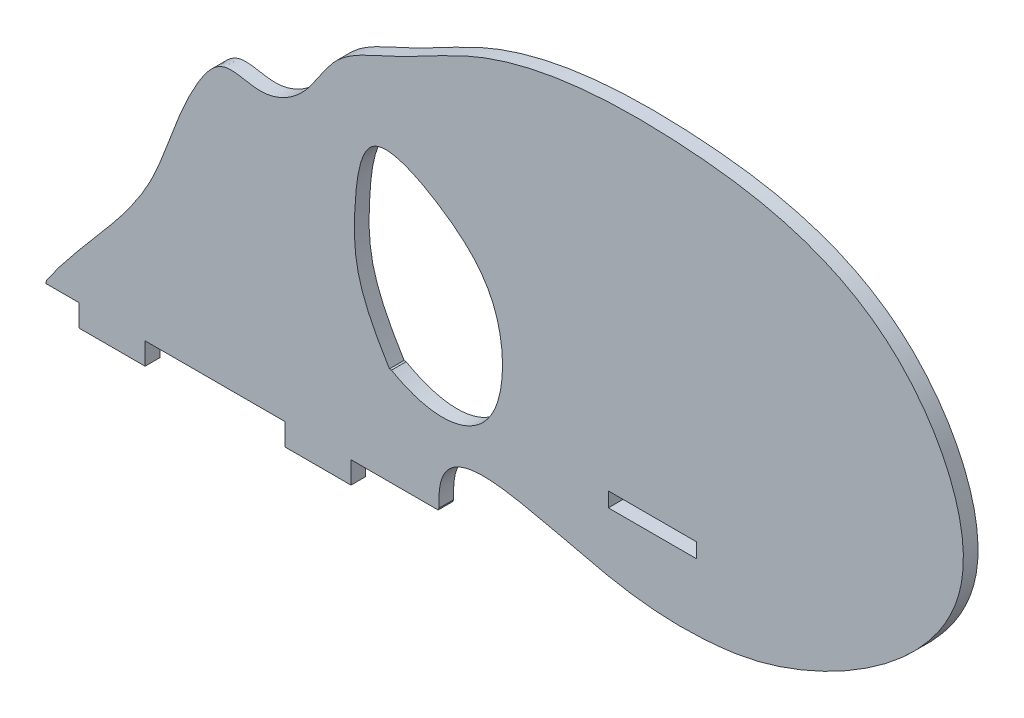
ISO-10303-21;
HEADER;
FILE_DESCRIPTION(('STEP AP214'),'2;1');
FILE_NAME('part.step','',(''),(''),'','','');
FILE_SCHEMA(('AUTOMOTIVE_DESIGN { 1 0 10303 214 1 1 1 1 }'));
ENDSEC;
DATA;
#1=APPLICATION_CONTEXT('core data for automotive mechanical design processes');
#2=APPLICATION_PROTOCOL_DEFINITION('international standard','automotive_design',2000,#1);
#3=PRODUCT_CONTEXT('',#1,'mechanical');
#4=PRODUCT('Part','Part','',(#3));
#5=PRODUCT_RELATED_PRODUCT_CATEGORY('part','',(#4));
#6=PRODUCT_DEFINITION_FORMATION('','',#4);
#7=PRODUCT_DEFINITION_CONTEXT('part definition',#1,'design');
#8=PRODUCT_DEFINITION('design','',#6,#7);
#9=PRODUCT_DEFINITION_SHAPE('','',#8);
#10=(LENGTH_UNIT() NAMED_UNIT(*) SI_UNIT(.MILLI.,.METRE.));
#11=(NAMED_UNIT(*) PLANE_ANGLE_UNIT() SI_UNIT($,.RADIAN.));
#12=(NAMED_UNIT(*) SI_UNIT($,.STERADIAN.) SOLID_ANGLE_UNIT());
#13=UNCERTAINTY_MEASURE_WITH_UNIT(LENGTH_MEASURE(1.E-05),#10,'distance_accuracy_value','');
#14=(GEOMETRIC_REPRESENTATION_CONTEXT(3) GLOBAL_UNCERTAINTY_ASSIGNED_CONTEXT((#13)) GLOBAL_UNIT_ASSIGNED_CONTEXT((#10,
#11,#12)) REPRESENTATION_CONTEXT('',''));
#15=CARTESIAN_POINT('',(0.,0.,0.));
#16=DIRECTION('',(0.,0.,1.));
#17=DIRECTION('',(1.,0.,0.));
#18=AXIS2_PLACEMENT_3D('',#15,#16,#17);
#19=CARTESIAN_POINT('',(46.7139427008838,14.6192871109886,0.529181018168488));
#20=DIRECTION('',(0.,0.,1.));
#21=DIRECTION('',(1.,0.,0.));
#22=AXIS2_PLACEMENT_3D('',#19,#20,#21);
#23=PLANE('',#22);
#24=DIRECTION('',(0.,-1.,0.));
#25=VECTOR('',#24,1.);
#26=CARTESIAN_POINT('',(97.4290343826983,14.6192871109886,0.529181018168488));
#27=LINE('',#26,#25);
#28=CARTESIAN_POINT('',(97.4290343826983,14.6192871109886,0.529181018168488));
#29=VERTEX_POINT('',#28);
#30=CARTESIAN_POINT('',(97.4290343826983,9.85678711098861,0.529181018168488));
#31=VERTEX_POINT('',#30);
#32=EDGE_CURVE('E304',#29,#31,#27,.T.);
#33=ORIENTED_EDGE('',*,*,#32,.T.);
#34=DIRECTION('',(1.,0.,0.));
#35=VECTOR('',#34,1.);
#36=CARTESIAN_POINT('',(46.7139427008838,9.85678711098862,0.529181018168488));
#37=LINE('',#36,#35);
#38=CARTESIAN_POINT('',(83.1415343826983,9.85678711098862,0.529181018168488));
#39=VERTEX_POINT('',#38);
#40=EDGE_CURVE('E645',#39,#31,#37,.T.);
#41=ORIENTED_EDGE('',*,*,#40,.F.);
#42=DIRECTION('',(0.,-1.,0.));
#43=VECTOR('',#42,1.);
#44=CARTESIAN_POINT('',(83.1415343826983,14.6192871109886,0.529181018168488));
#45=LINE('',#44,#43);
#46=CARTESIAN_POINT('',(83.1415343826983,14.6192871109886,0.529181018168488));
#47=VERTEX_POINT('',#46);
#48=EDGE_CURVE('E641',#47,#39,#45,.T.);
#49=ORIENTED_EDGE('',*,*,#48,.F.);
#50=DIRECTION('',(1.,0.,0.));
#51=VECTOR('',#50,1.);
#52=CARTESIAN_POINT('',(75.9977843826983,14.6192871109886,0.529181018168488));
#53=LINE('',#52,#51);
#54=CARTESIAN_POINT('',(75.9977843826983,14.6192871109886,0.529181018168488));
#55=VERTEX_POINT('',#54);
#56=EDGE_CURVE('E360',#55,#47,#53,.T.);
#57=ORIENTED_EDGE('',*,*,#56,.F.);
#58=DIRECTION('',(-0.131362101592818,-0.991334453282603,0.));
#59=VECTOR('',#58,1.);
#60=CARTESIAN_POINT('',(76.0795877483781,15.2366226576158,0.529181018168488));
#61=LINE('',#60,#59);
#62=CARTESIAN_POINT('',(76.0795877483781,15.2366226576158,0.529181018168488));
#63=VERTEX_POINT('',#62);
#64=EDGE_CURVE('E364',#63,#55,#61,.T.);
#65=ORIENTED_EDGE('',*,*,#64,.F.);
#66=CARTESIAN_POINT('',(76.0795877483781,15.2366226576158,0.529181018168488));
#67=CARTESIAN_POINT('',(78.5136995982395,18.9196984781947,0.529181018168488));
#68=CARTESIAN_POINT('',(86.384545653576,28.483276786645,0.529181018168488));
#69=CARTESIAN_POINT('',(100.791998823082,44.6915469108842,0.529181018168488));
#70=CARTESIAN_POINT('',(104.435020119309,62.9076807843859,0.529181018168488));
#71=CARTESIAN_POINT('',(113.904961423502,76.2523157443996,0.529181018168488));
#72=CARTESIAN_POINT('',(123.275231297971,72.424496811775,0.529181018168488));
#73=CARTESIAN_POINT('',(132.927126722077,77.913549351878,0.529181018168488));
#74=CARTESIAN_POINT('',(137.9633658612,89.4214305439055,0.529181018168488));
#75=CARTESIAN_POINT('',(152.686437338271,94.8702639667779,0.529181018168488));
#76=CARTESIAN_POINT('',(175.095319894484,108.643375828435,0.529181018168488));
#77=CARTESIAN_POINT('',(214.4991228579,111.528800242128,0.529181018168488));
#78=CARTESIAN_POINT('',(260.687847393146,101.991149201834,0.529181018168488));
#79=CARTESIAN_POINT('',(280.794988715995,60.2074091425071,0.529181018168488));
#80=CARTESIAN_POINT('',(260.092155651938,32.8972212167917,0.529181018168488));
#81=CARTESIAN_POINT('',(239.430987817911,23.2489467627401,0.529181018168488));
#82=CARTESIAN_POINT('',(230.113208091843,20.8819530988946,0.529181018168488));
#83=B_SPLINE_CURVE_WITH_KNOTS('',3,(#66,#67,#68,#69,#70,#71,#72,#73,#74,#75,#76,#77,#78,#79,#80,
#81,#82),.UNSPECIFIED.,.F.,.F.,(4,1,1,1,1,1,1,1,1,1,1,1,1,1,4),(0.00226241646687188,
0.042851836601177,0.112266622936458,0.191197814197318,0.215776327855184,0.238595903349676,
0.269392038066296,0.305262453845229,0.346354398059261,0.40290844863562,0.54272456628568,
0.688695661350589,0.802663517836792,0.881805413191487,0.976115532404342),.UNSPECIFIED.);
#84=CARTESIAN_POINT('',(230.113208091843,20.8819530988946,0.529181018168488));
#85=VERTEX_POINT('',#84);
#86=EDGE_CURVE('E326',#63,#85,#83,.T.);
#87=ORIENTED_EDGE('',*,*,#86,.T.);
#88=DIRECTION('',(-0.9804127584769,-0.196953860118849,0.));
#89=VECTOR('',#88,1.);
#90=CARTESIAN_POINT('',(230.113208091843,20.8819530988946,0.529181018168488));
#91=LINE('',#90,#89);
#92=CARTESIAN_POINT('',(225.059321782838,19.8666843678892,0.529181018168488));
#93=VERTEX_POINT('',#92);
#94=EDGE_CURVE('E332',#85,#93,#91,.T.);
#95=ORIENTED_EDGE('',*,*,#94,.T.);
#96=CARTESIAN_POINT('',(160.990463266534,15.0540625014356,0.529181018168488));
#97=CARTESIAN_POINT('',(160.961317729062,15.7990132081779,0.529181018168488));
#98=CARTESIAN_POINT('',(160.750347397598,27.8817390805604,0.529181018168488));
#99=CARTESIAN_POINT('',(180.241454751576,25.1480193040991,0.529181018168488));
#100=CARTESIAN_POINT('',(203.516820255264,18.5816502297192,0.529181018168488));
#101=CARTESIAN_POINT('',(217.022935127163,18.7029481051344,0.529181018168488));
#102=CARTESIAN_POINT('',(225.059321782838,19.8666843678892,0.529181018168488));
#103=B_SPLINE_CURVE_WITH_KNOTS('',3,(#96,#97,#98,#99,#100,#101,#102),.UNSPECIFIED.,.F.,.F.,(4,1,
1,1,4),(0.00653865057941829,0.0242648396256075,0.142987538878755,0.246415567474758,
0.403693801674327),.UNSPECIFIED.);
#104=CARTESIAN_POINT('',(160.990463266534,15.0540625014356,0.529181018168488));
#105=VERTEX_POINT('',#104);
#106=EDGE_CURVE('E338',#105,#93,#103,.T.);
#107=ORIENTED_EDGE('',*,*,#106,.F.);
#108=DIRECTION('',(-0.373907961816468,-0.927465813973892,0.));
#109=VECTOR('',#108,1.);
#110=CARTESIAN_POINT('',(160.990463266534,15.0540625014356,0.529181018168488));
#111=LINE('',#110,#109);
#112=CARTESIAN_POINT('',(160.815183512132,14.6192871109886,0.529181018168488));
#113=VERTEX_POINT('',#112);
#114=EDGE_CURVE('E343',#105,#113,#111,.T.);
#115=ORIENTED_EDGE('',*,*,#114,.T.);
#116=DIRECTION('',(1.,0.,0.));
#117=VECTOR('',#116,1.);
#118=CARTESIAN_POINT('',(141.963942700884,14.6192871109886,0.529181018168488));
#119=LINE('',#118,#117);
#120=CARTESIAN_POINT('',(141.963942700884,14.6192871109886,0.529181018168488));
#121=VERTEX_POINT('',#120);
#122=EDGE_CURVE('E349',#121,#113,#119,.T.);
#123=ORIENTED_EDGE('',*,*,#122,.F.);
#124=DIRECTION('',(0.,-1.,0.));
#125=VECTOR('',#124,1.);
#126=CARTESIAN_POINT('',(141.963942700884,14.6192871109886,0.529181018168488));
#127=LINE('',#126,#125);
#128=CARTESIAN_POINT('',(141.963942700884,9.85678711098862,0.529181018168488));
#129=VERTEX_POINT('',#128);
#130=EDGE_CURVE('E352',#121,#129,#127,.T.);
#131=ORIENTED_EDGE('',*,*,#130,.T.);
#132=DIRECTION('',(1.,0.,0.));
#133=VECTOR('',#132,1.);
#134=CARTESIAN_POINT('',(127.676442700884,9.85678711098862,0.529181018168488));
#135=LINE('',#134,#133);
#136=CARTESIAN_POINT('',(127.676442700884,9.85678711098862,0.529181018168488));
#137=VERTEX_POINT('',#136);
#138=EDGE_CURVE('E355',#137,#129,#135,.T.);
#139=ORIENTED_EDGE('',*,*,#138,.F.);
#140=DIRECTION('',(0.,-1.,0.));
#141=VECTOR('',#140,1.);
#142=CARTESIAN_POINT('',(127.676442700884,14.6192871109886,0.529181018168488));
#143=LINE('',#142,#141);
#144=CARTESIAN_POINT('',(127.676442700884,14.6192871109886,0.529181018168488));
#145=VERTEX_POINT('',#144);
#146=EDGE_CURVE('E358',#145,#137,#143,.T.);
#147=ORIENTED_EDGE('',*,*,#146,.F.);
#148=EDGE_CURVE('E363',#29,#145,#53,.T.);
#149=ORIENTED_EDGE('',*,*,#148,.F.);
#150=EDGE_LOOP('',(#33,#41,#49,#57,#65,#87,#95,#107,#115,#123,#131,#139,#147,#149));
#151=FACE_BOUND('',#150,.T.);
#152=CARTESIAN_POINT('',(150.707814048732,35.7612794961737,0.529181018168488));
#153=CARTESIAN_POINT('',(150.383039261352,35.7352008846273,0.529181018168488));
#154=CARTESIAN_POINT('',(150.271989668101,35.7901518709999,0.529181018168488));
#155=B_SPLINE_CURVE_WITH_KNOTS('',2,(#152,#153,#154),.UNSPECIFIED.,.F.,.F.,(3,3),(0.,
0.0587400437451956),.UNSPECIFIED.);
#156=CARTESIAN_POINT('',(150.707814048732,35.7612794961737,0.529181018168488));
#157=VERTEX_POINT('',#156);
#158=CARTESIAN_POINT('',(150.271989668101,35.7901518709999,0.529181018168488));
#159=VERTEX_POINT('',#158);
#160=EDGE_CURVE('E428',#157,#159,#155,.T.);
#161=ORIENTED_EDGE('',*,*,#160,.F.);
#162=CARTESIAN_POINT('',(150.271989668101,35.7901518709999,0.529181018168488));
#163=CARTESIAN_POINT('',(147.272484096382,40.6583748058132,0.529181018168488));
#164=CARTESIAN_POINT('',(142.65739432738,49.1509405033225,0.529181018168488));
#165=CARTESIAN_POINT('',(142.509838720055,62.7192927520831,0.529181018168488));
#166=CARTESIAN_POINT('',(144.707936444547,80.4577396705887,0.529181018168488));
#167=CARTESIAN_POINT('',(163.548850960502,71.2967227420742,0.529181018168488));
#168=CARTESIAN_POINT('',(175.307877403917,59.6011667715246,0.529181018168488));
#169=CARTESIAN_POINT('',(175.242309153813,32.8659839064675,0.529181018168488));
#170=CARTESIAN_POINT('',(160.498560619477,30.190843255926,0.529181018168488));
#171=CARTESIAN_POINT('',(150.707814048732,35.7612794961737,0.529181018168488));
#172=B_SPLINE_CURVE_WITH_KNOTS('',3,(#162,#163,#164,#165,#166,#167,#168,#169,#170,#171),
.UNSPECIFIED.,.F.,.F.,(4,1,1,1,1,1,1,4),(0.1636315853678,0.279802377306264,0.365863399168879,
0.45947757732539,0.562318617098575,0.686929258428295,0.810907839038093,1.),.UNSPECIFIED.);
#173=EDGE_CURVE('E434',#159,#157,#172,.T.);
#174=ORIENTED_EDGE('',*,*,#173,.F.);
#175=EDGE_LOOP('',(#161,#174));
#176=FACE_BOUND('',#175,.T.);
#177=DIRECTION('',(0.,1.,0.));
#178=VECTOR('',#177,1.);
#179=CARTESIAN_POINT('',(216.670767504084,33.4268021560606,0.52918101817114));
#180=LINE('',#179,#178);
#181=CARTESIAN_POINT('',(216.670767504084,33.4268021560606,0.52918101817114));
#182=VERTEX_POINT('',#181);
#183=CARTESIAN_POINT('',(216.670767504084,36.6018021560606,0.52918101817114));
#184=VERTEX_POINT('',#183);
#185=EDGE_CURVE('E667',#182,#184,#180,.T.);
#186=ORIENTED_EDGE('',*,*,#185,.T.);
#187=DIRECTION('',(1.,0.,0.));
#188=VECTOR('',#187,1.);
#189=CARTESIAN_POINT('',(46.7139427008838,36.6018021560606,0.529181018168488));
#190=LINE('',#189,#188);
#191=CARTESIAN_POINT('',(197.620767504084,36.6018021560606,0.529181018171382));
#192=VERTEX_POINT('',#191);
#193=EDGE_CURVE('E441',#192,#184,#190,.T.);
#194=ORIENTED_EDGE('',*,*,#193,.F.);
#195=DIRECTION('',(0.,1.,0.));
#196=VECTOR('',#195,1.);
#197=CARTESIAN_POINT('',(197.620767504084,33.4268021560606,0.529181018171382));
#198=LINE('',#197,#196);
#199=CARTESIAN_POINT('',(197.620767504084,33.4268021560606,0.529181018168488));
#200=VERTEX_POINT('',#199);
#201=EDGE_CURVE('E284',#200,#192,#198,.T.);
#202=ORIENTED_EDGE('',*,*,#201,.F.);
#203=DIRECTION('',(1.,0.,0.));
#204=VECTOR('',#203,1.);
#205=CARTESIAN_POINT('',(197.620767504084,33.4268021560606,0.529181018171382));
#206=LINE('',#205,#204);
#207=EDGE_CURVE('E285',#200,#182,#206,.T.);
#208=ORIENTED_EDGE('',*,*,#207,.T.);
#209=EDGE_LOOP('',(#186,#194,#202,#208));
#210=FACE_BOUND('',#209,.T.);
#211=ADVANCED_FACE('F145',(#151,#176,#210),#23,.F.);
#212=CARTESIAN_POINT('',(46.7139427008838,14.6192871109886,3.70418101816849));
#213=DIRECTION('',(0.,0.,1.));
#214=DIRECTION('',(1.,0.,0.));
#215=AXIS2_PLACEMENT_3D('',#212,#213,#214);
#216=PLANE('',#215);
#217=DIRECTION('',(0.,1.,0.));
#218=VECTOR('',#217,1.);
#219=CARTESIAN_POINT('',(197.620767504084,33.4268021560606,3.70418101817157));
#220=LINE('',#219,#218);
#221=CARTESIAN_POINT('',(197.620767504084,33.4268021560606,3.70418101817157));
#222=VERTEX_POINT('',#221);
#223=CARTESIAN_POINT('',(197.620767504084,36.6018021560606,3.70418101816849));
#224=VERTEX_POINT('',#223);
#225=EDGE_CURVE('E280',#222,#224,#220,.T.);
#226=ORIENTED_EDGE('',*,*,#225,.T.);
#227=DIRECTION('',(1.,0.,0.));
#228=VECTOR('',#227,1.);
#229=CARTESIAN_POINT('',(46.7139427008838,36.6018021560606,3.70418101816849));
#230=LINE('',#229,#228);
#231=CARTESIAN_POINT('',(216.670767504084,36.6018021560606,3.70418101817132));
#232=VERTEX_POINT('',#231);
#233=EDGE_CURVE('E12',#224,#232,#230,.T.);
#234=ORIENTED_EDGE('',*,*,#233,.T.);
#235=DIRECTION('',(0.,1.,0.));
#236=VECTOR('',#235,1.);
#237=CARTESIAN_POINT('',(216.670767504084,33.4268021560606,3.70418101817132));
#238=LINE('',#237,#236);
#239=CARTESIAN_POINT('',(216.670767504084,33.4268021560606,3.70418101817132));
#240=VERTEX_POINT('',#239);
#241=EDGE_CURVE('E296',#240,#232,#238,.T.);
#242=ORIENTED_EDGE('',*,*,#241,.F.);
#243=DIRECTION('',(1.,0.,0.));
#244=VECTOR('',#243,1.);
#245=CARTESIAN_POINT('',(46.7139427008838,33.4268021560606,3.70418101816849));
#246=LINE('',#245,#244);
#247=EDGE_CURVE('E153',#222,#240,#246,.T.);
#248=ORIENTED_EDGE('',*,*,#247,.F.);
#249=EDGE_LOOP('',(#226,#234,#242,#248));
#250=FACE_BOUND('',#249,.T.);
#251=DIRECTION('',(0.,-1.,0.));
#252=VECTOR('',#251,1.);
#253=CARTESIAN_POINT('',(97.4290343826983,14.6192871109886,3.70418101816849));
#254=LINE('',#253,#252);
#255=CARTESIAN_POINT('',(97.4290343826983,14.6192871109886,3.70418101816849));
#256=VERTEX_POINT('',#255);
#257=CARTESIAN_POINT('',(97.4290343826983,9.85678711098861,3.70418101816849));
#258=VERTEX_POINT('',#257);
#259=EDGE_CURVE('E649',#256,#258,#254,.T.);
#260=ORIENTED_EDGE('',*,*,#259,.F.);
#261=DIRECTION('',(1.,0.,0.));
#262=VECTOR('',#261,1.);
#263=CARTESIAN_POINT('',(75.9977843826983,14.6192871109886,3.70418101816849));
#264=LINE('',#263,#262);
#265=CARTESIAN_POINT('',(127.676442700884,14.6192871109886,3.70418101816849));
#266=VERTEX_POINT('',#265);
#267=EDGE_CURVE('E420',#256,#266,#264,.T.);
#268=ORIENTED_EDGE('',*,*,#267,.T.);
#269=DIRECTION('',(0.,-1.,0.));
#270=VECTOR('',#269,1.);
#271=CARTESIAN_POINT('',(127.676442700884,14.6192871109886,3.70418101816849));
#272=LINE('',#271,#270);
#273=CARTESIAN_POINT('',(127.676442700884,9.85678711098862,3.70418101816849));
#274=VERTEX_POINT('',#273);
#275=EDGE_CURVE('E415',#266,#274,#272,.T.);
#276=ORIENTED_EDGE('',*,*,#275,.T.);
#277=DIRECTION('',(1.,0.,0.));
#278=VECTOR('',#277,1.);
#279=CARTESIAN_POINT('',(127.676442700884,9.85678711098862,3.70418101816849));
#280=LINE('',#279,#278);
#281=CARTESIAN_POINT('',(141.963942700884,9.85678711098862,3.70418101816849));
#282=VERTEX_POINT('',#281);
#283=EDGE_CURVE('E413',#274,#282,#280,.T.);
#284=ORIENTED_EDGE('',*,*,#283,.T.);
#285=DIRECTION('',(0.,-1.,0.));
#286=VECTOR('',#285,1.);
#287=CARTESIAN_POINT('',(141.963942700884,14.6192871109886,3.70418101816849));
#288=LINE('',#287,#286);
#289=CARTESIAN_POINT('',(141.963942700884,14.6192871109886,3.70418101816849));
#290=VERTEX_POINT('',#289);
#291=EDGE_CURVE('E410',#290,#282,#288,.T.);
#292=ORIENTED_EDGE('',*,*,#291,.F.);
#293=DIRECTION('',(1.,0.,0.));
#294=VECTOR('',#293,1.);
#295=CARTESIAN_POINT('',(141.963942700884,14.6192871109886,3.70418101816849));
#296=LINE('',#295,#294);
#297=CARTESIAN_POINT('',(160.815183512132,14.6192871109886,3.70418101816849));
#298=VERTEX_POINT('',#297);
#299=EDGE_CURVE('E408',#290,#298,#296,.T.);
#300=ORIENTED_EDGE('',*,*,#299,.T.);
#301=DIRECTION('',(-0.373907961816468,-0.927465813973892,0.));
#302=VECTOR('',#301,1.);
#303=CARTESIAN_POINT('',(160.990463266534,15.0540625014356,3.70418101816849));
#304=LINE('',#303,#302);
#305=CARTESIAN_POINT('',(160.990463266534,15.0540625014356,3.70418101816849));
#306=VERTEX_POINT('',#305);
#307=EDGE_CURVE('E402',#306,#298,#304,.T.);
#308=ORIENTED_EDGE('',*,*,#307,.F.);
#309=CARTESIAN_POINT('',(160.990463266534,15.0540625014356,3.70418101816849));
#310=CARTESIAN_POINT('',(160.961317729062,15.7990132081779,3.70418101816849));
#311=CARTESIAN_POINT('',(160.750347397598,27.8817390805604,3.70418101816849));
#312=CARTESIAN_POINT('',(180.241454751576,25.1480193040991,3.70418101816849));
#313=CARTESIAN_POINT('',(203.516820255264,18.5816502297192,3.70418101816849));
#314=CARTESIAN_POINT('',(217.022935127163,18.7029481051344,3.70418101816849));
#315=CARTESIAN_POINT('',(225.059321782838,19.8666843678892,3.70418101816849));
#316=B_SPLINE_CURVE_WITH_KNOTS('',3,(#309,#310,#311,#312,#313,#314,#315),.UNSPECIFIED.,.F.,.F.,
(4,1,1,1,4),(0.00653865057941829,0.0242648396256075,0.142987538878755,0.246415567474758,
0.403693801674327),.UNSPECIFIED.);
#317=CARTESIAN_POINT('',(225.059321782838,19.8666843678892,3.70418101816849));
#318=VERTEX_POINT('',#317);
#319=EDGE_CURVE('E397',#306,#318,#316,.T.);
#320=ORIENTED_EDGE('',*,*,#319,.T.);
#321=DIRECTION('',(-0.9804127584769,-0.196953860118849,0.));
#322=VECTOR('',#321,1.);
#323=CARTESIAN_POINT('',(230.113208091843,20.8819530988946,3.70418101816849));
#324=LINE('',#323,#322);
#325=CARTESIAN_POINT('',(230.113208091843,20.8819530988946,3.70418101816849));
#326=VERTEX_POINT('',#325);
#327=EDGE_CURVE('E373',#326,#318,#324,.T.);
#328=ORIENTED_EDGE('',*,*,#327,.F.);
#329=CARTESIAN_POINT('',(76.0795877483781,15.2366226576158,3.70418101816849));
#330=CARTESIAN_POINT('',(78.5136995982395,18.9196984781947,3.70418101816849));
#331=CARTESIAN_POINT('',(86.384545653576,28.483276786645,3.70418101816849));
#332=CARTESIAN_POINT('',(100.791998823082,44.6915469108842,3.70418101816849));
#333=CARTESIAN_POINT('',(104.435020119309,62.9076807843859,3.70418101816849));
#334=CARTESIAN_POINT('',(113.904961423502,76.2523157443996,3.70418101816849));
#335=CARTESIAN_POINT('',(123.275231297971,72.424496811775,3.70418101816849));
#336=CARTESIAN_POINT('',(132.927126722077,77.913549351878,3.70418101816849));
#337=CARTESIAN_POINT('',(137.9633658612,89.4214305439055,3.70418101816849));
#338=CARTESIAN_POINT('',(152.686437338271,94.8702639667779,3.70418101816849));
#339=CARTESIAN_POINT('',(175.095319894484,108.643375828435,3.70418101816849));
#340=CARTESIAN_POINT('',(214.4991228579,111.528800242128,3.70418101816849));
#341=CARTESIAN_POINT('',(260.687847393146,101.991149201834,3.70418101816849));
#342=CARTESIAN_POINT('',(280.794988715995,60.2074091425071,3.70418101816849));
#343=CARTESIAN_POINT('',(260.092155651938,32.8972212167917,3.70418101816849));
#344=CARTESIAN_POINT('',(239.430987817911,23.2489467627401,3.70418101816849));
#345=CARTESIAN_POINT('',(230.113208091843,20.8819530988946,3.70418101816849));
#346=B_SPLINE_CURVE_WITH_KNOTS('',3,(#329,#330,#331,#332,#333,#334,#335,#336,#337,#338,#339,
#340,#341,#342,#343,#344,#345),.UNSPECIFIED.,.F.,.F.,(4,1,1,1,1,1,1,1,1,1,1,1,1,1,4),
(0.00226241646687188,0.042851836601177,0.112266622936458,0.191197814197318,0.215776327855184,
0.238595903349676,0.269392038066296,0.305262453845229,0.346354398059261,0.40290844863562,
0.54272456628568,0.688695661350589,0.802663517836792,0.881805413191487,0.976115532404342),.UNSPECIFIED.);
#347=CARTESIAN_POINT('',(76.0795877483781,15.2366226576158,3.70418101816849));
#348=VERTEX_POINT('',#347);
#349=EDGE_CURVE('E325',#348,#326,#346,.T.);
#350=ORIENTED_EDGE('',*,*,#349,.F.);
#351=DIRECTION('',(-0.131362101592818,-0.991334453282603,0.));
#352=VECTOR('',#351,1.);
#353=CARTESIAN_POINT('',(76.0795877483781,15.2366226576158,3.70418101816849));
#354=LINE('',#353,#352);
#355=CARTESIAN_POINT('',(75.9977843826983,14.6192871109886,3.70418101816849));
#356=VERTEX_POINT('',#355);
#357=EDGE_CURVE('E331',#348,#356,#354,.T.);
#358=ORIENTED_EDGE('',*,*,#357,.T.);
#359=CARTESIAN_POINT('',(83.1415343826983,14.6192871109886,3.70418101816849));
#360=VERTEX_POINT('',#359);
#361=EDGE_CURVE('E417',#356,#360,#264,.T.);
#362=ORIENTED_EDGE('',*,*,#361,.T.);
#363=DIRECTION('',(0.,-1.,0.));
#364=VECTOR('',#363,1.);
#365=CARTESIAN_POINT('',(83.1415343826983,14.6192871109886,3.70418101816849));
#366=LINE('',#365,#364);
#367=CARTESIAN_POINT('',(83.1415343826983,9.85678711098862,3.70418101816849));
#368=VERTEX_POINT('',#367);
#369=EDGE_CURVE('E660',#360,#368,#366,.T.);
#370=ORIENTED_EDGE('',*,*,#369,.T.);
#371=DIRECTION('',(1.,0.,0.));
#372=VECTOR('',#371,1.);
#373=CARTESIAN_POINT('',(46.7139427008838,9.85678711098862,3.70418101816849));
#374=LINE('',#373,#372);
#375=EDGE_CURVE('E657',#368,#258,#374,.T.);
#376=ORIENTED_EDGE('',*,*,#375,.T.);
#377=EDGE_LOOP('',(#260,#268,#276,#284,#292,#300,#308,#320,#328,#350,#358,#362,#370,#376));
#378=FACE_BOUND('',#377,.T.);
#379=CARTESIAN_POINT('',(150.271989668101,35.7901518709999,3.70418101816849));
#380=CARTESIAN_POINT('',(147.272484096382,40.6583748058132,3.70418101816849));
#381=CARTESIAN_POINT('',(142.65739432738,49.1509405033225,3.70418101816849));
#382=CARTESIAN_POINT('',(142.509838720055,62.7192927520831,3.70418101816849));
#383=CARTESIAN_POINT('',(144.707936444547,80.4577396705887,3.70418101816849));
#384=CARTESIAN_POINT('',(163.548850960502,71.2967227420742,3.70418101816849));
#385=CARTESIAN_POINT('',(175.307877403917,59.6011667715246,3.70418101816849));
#386=CARTESIAN_POINT('',(175.242309153813,32.8659839064675,3.70418101816849));
#387=CARTESIAN_POINT('',(160.498560619477,30.190843255926,3.70418101816849));
#388=CARTESIAN_POINT('',(150.707814048732,35.7612794961737,3.70418101816849));
#389=B_SPLINE_CURVE_WITH_KNOTS('',3,(#379,#380,#381,#382,#383,#384,#385,#386,#387,#388),
.UNSPECIFIED.,.F.,.F.,(4,1,1,1,1,1,1,4),(0.1636315853678,0.279802377306264,0.365863399168879,
0.45947757732539,0.562318617098575,0.686929258428295,0.810907839038093,1.),.UNSPECIFIED.);
#390=CARTESIAN_POINT('',(150.271989668101,35.7901518709999,3.70418101816849));
#391=VERTEX_POINT('',#390);
#392=CARTESIAN_POINT('',(150.707814048732,35.7612794961737,3.70418101816849));
#393=VERTEX_POINT('',#392);
#394=EDGE_CURVE('E433',#391,#393,#389,.T.);
#395=ORIENTED_EDGE('',*,*,#394,.T.);
#396=CARTESIAN_POINT('',(150.707814048732,35.7612794961737,3.70418101816849));
#397=CARTESIAN_POINT('',(150.383039261352,35.7352008846273,3.70418101816849));
#398=CARTESIAN_POINT('',(150.271989668101,35.7901518709999,3.70418101816849));
#399=B_SPLINE_CURVE_WITH_KNOTS('',2,(#396,#397,#398),.UNSPECIFIED.,.F.,.F.,(3,3),(0.,
0.0587400437451956),.UNSPECIFIED.);
#400=EDGE_CURVE('E426',#393,#391,#399,.T.);
#401=ORIENTED_EDGE('',*,*,#400,.T.);
#402=EDGE_LOOP('',(#395,#401));
#403=FACE_BOUND('',#402,.T.);
#404=ADVANCED_FACE('F294',(#250,#378,#403),#216,.T.);
#405=CARTESIAN_POINT('',(83.1415343826983,14.6192871109886,3.70418101816849));
#406=DIRECTION('',(1.,0.,0.));
#407=DIRECTION('',(0.,0.,-1.));
#408=AXIS2_PLACEMENT_3D('',#405,#406,#407);
#409=PLANE('',#408);
#410=ORIENTED_EDGE('',*,*,#48,.T.);
#411=DIRECTION('',(0.,0.,-1.));
#412=VECTOR('',#411,1.);
#413=CARTESIAN_POINT('',(83.1415343826983,9.85678711098862,3.70418101816849));
#414=LINE('',#413,#412);
#415=EDGE_CURVE('E656',#368,#39,#414,.T.);
#416=ORIENTED_EDGE('',*,*,#415,.F.);
#417=ORIENTED_EDGE('',*,*,#369,.F.);
#418=DIRECTION('',(0.,0.,-1.));
#419=VECTOR('',#418,1.);
#420=CARTESIAN_POINT('',(83.1415343826983,14.6192871109886,3.70418101816849));
#421=LINE('',#420,#419);
#422=EDGE_CURVE('E298',#360,#47,#421,.T.);
#423=ORIENTED_EDGE('',*,*,#422,.T.);
#424=EDGE_LOOP('',(#410,#416,#417,#423));
#425=FACE_BOUND('',#424,.T.);
#426=ADVANCED_FACE('F466',(#425),#409,.F.);
#427=CARTESIAN_POINT('',(46.7139427008838,9.85678711098862,3.70418101816849));
#428=DIRECTION('',(0.,1.,0.));
#429=DIRECTION('',(-1.,0.,0.));
#430=AXIS2_PLACEMENT_3D('',#427,#428,#429);
#431=PLANE('',#430);
#432=ORIENTED_EDGE('',*,*,#40,.T.);
#433=DIRECTION('',(0.,0.,-1.));
#434=VECTOR('',#433,1.);
#435=CARTESIAN_POINT('',(97.4290343826983,9.85678711098861,3.70418101816849));
#436=LINE('',#435,#434);
#437=EDGE_CURVE('E654',#258,#31,#436,.T.);
#438=ORIENTED_EDGE('',*,*,#437,.F.);
#439=ORIENTED_EDGE('',*,*,#375,.F.);
#440=ORIENTED_EDGE('',*,*,#415,.T.);
#441=EDGE_LOOP('',(#432,#438,#439,#440));
#442=FACE_BOUND('',#441,.T.);
#443=ADVANCED_FACE('F464',(#442),#431,.F.);
#444=CARTESIAN_POINT('',(97.4290343826983,14.6192871109886,3.70418101816849));
#445=DIRECTION('',(1.,0.,0.));
#446=DIRECTION('',(0.,0.,-1.));
#447=AXIS2_PLACEMENT_3D('',#444,#445,#446);
#448=PLANE('',#447);
#449=ORIENTED_EDGE('',*,*,#32,.F.);
#450=DIRECTION('',(0.,0.,-1.));
#451=VECTOR('',#450,1.);
#452=CARTESIAN_POINT('',(97.4290343826983,14.6192871109886,3.70418101816849));
#453=LINE('',#452,#451);
#454=EDGE_CURVE('E297',#256,#29,#453,.T.);
#455=ORIENTED_EDGE('',*,*,#454,.F.);
#456=ORIENTED_EDGE('',*,*,#259,.T.);
#457=ORIENTED_EDGE('',*,*,#437,.T.);
#458=EDGE_LOOP('',(#449,#455,#456,#457));
#459=FACE_BOUND('',#458,.T.);
#460=ADVANCED_FACE('F460',(#459),#448,.T.);
#461=CARTESIAN_POINT('',(75.9977843826983,14.6192871109886,3.70418101816849));
#462=DIRECTION('',(0.,1.,0.));
#463=DIRECTION('',(-1.,0.,0.));
#464=AXIS2_PLACEMENT_3D('',#461,#462,#463);
#465=PLANE('',#464);
#466=ORIENTED_EDGE('',*,*,#56,.T.);
#467=ORIENTED_EDGE('',*,*,#422,.F.);
#468=ORIENTED_EDGE('',*,*,#361,.F.);
#469=DIRECTION('',(0.,0.,-1.));
#470=VECTOR('',#469,1.);
#471=CARTESIAN_POINT('',(75.9977843826983,14.6192871109886,3.70418101816849));
#472=LINE('',#471,#470);
#473=EDGE_CURVE('E301',#356,#55,#472,.T.);
#474=ORIENTED_EDGE('',*,*,#473,.T.);
#475=EDGE_LOOP('',(#466,#467,#468,#474));
#476=FACE_BOUND('',#475,.T.);
#477=ADVANCED_FACE('F463',(#476),#465,.F.);
#478=ORIENTED_EDGE('',*,*,#454,.T.);
#479=ORIENTED_EDGE('',*,*,#148,.T.);
#480=DIRECTION('',(0.,0.,-1.));
#481=VECTOR('',#480,1.);
#482=CARTESIAN_POINT('',(127.676442700884,14.6192871109886,3.70418101816849));
#483=LINE('',#482,#481);
#484=EDGE_CURVE('E305',#266,#145,#483,.T.);
#485=ORIENTED_EDGE('',*,*,#484,.F.);
#486=ORIENTED_EDGE('',*,*,#267,.F.);
#487=EDGE_LOOP('',(#478,#479,#485,#486));
#488=FACE_BOUND('',#487,.T.);
#489=ADVANCED_FACE('F529',(#488),#465,.F.);
#490=CARTESIAN_POINT('',(127.676442700884,14.6192871109886,3.70418101816849));
#491=DIRECTION('',(1.,0.,0.));
#492=DIRECTION('',(0.,0.,-1.));
#493=AXIS2_PLACEMENT_3D('',#490,#491,#492);
#494=PLANE('',#493);
#495=ORIENTED_EDGE('',*,*,#146,.T.);
#496=DIRECTION('',(0.,0.,-1.));
#497=VECTOR('',#496,1.);
#498=CARTESIAN_POINT('',(127.676442700884,9.85678711098862,3.70418101816849));
#499=LINE('',#498,#497);
#500=EDGE_CURVE('E308',#274,#137,#499,.T.);
#501=ORIENTED_EDGE('',*,*,#500,.F.);
#502=ORIENTED_EDGE('',*,*,#275,.F.);
#503=ORIENTED_EDGE('',*,*,#484,.T.);
#504=EDGE_LOOP('',(#495,#501,#502,#503));
#505=FACE_BOUND('',#504,.T.);
#506=ADVANCED_FACE('F570',(#505),#494,.F.);
#507=CARTESIAN_POINT('',(127.676442700884,9.85678711098862,3.70418101816849));
#508=DIRECTION('',(0.,1.,0.));
#509=DIRECTION('',(0.,0.,1.));
#510=AXIS2_PLACEMENT_3D('',#507,#508,#509);
#511=PLANE('',#510);
#512=ORIENTED_EDGE('',*,*,#138,.T.);
#513=DIRECTION('',(0.,0.,-1.));
#514=VECTOR('',#513,1.);
#515=CARTESIAN_POINT('',(141.963942700884,9.85678711098862,3.70418101816849));
#516=LINE('',#515,#514);
#517=EDGE_CURVE('E311',#282,#129,#516,.T.);
#518=ORIENTED_EDGE('',*,*,#517,.F.);
#519=ORIENTED_EDGE('',*,*,#283,.F.);
#520=ORIENTED_EDGE('',*,*,#500,.T.);
#521=EDGE_LOOP('',(#512,#518,#519,#520));
#522=FACE_BOUND('',#521,.T.);
#523=ADVANCED_FACE('F562',(#522),#511,.F.);
#524=CARTESIAN_POINT('',(141.963942700884,14.6192871109886,3.70418101816849));
#525=DIRECTION('',(1.,0.,0.));
#526=DIRECTION('',(0.,0.,-1.));
#527=AXIS2_PLACEMENT_3D('',#524,#525,#526);
#528=PLANE('',#527);
#529=ORIENTED_EDGE('',*,*,#130,.F.);
#530=DIRECTION('',(0.,0.,-1.));
#531=VECTOR('',#530,1.);
#532=CARTESIAN_POINT('',(141.963942700884,14.6192871109886,3.70418101816849));
#533=LINE('',#532,#531);
#534=EDGE_CURVE('E313',#290,#121,#533,.T.);
#535=ORIENTED_EDGE('',*,*,#534,.F.);
#536=ORIENTED_EDGE('',*,*,#291,.T.);
#537=ORIENTED_EDGE('',*,*,#517,.T.);
#538=EDGE_LOOP('',(#529,#535,#536,#537));
#539=FACE_BOUND('',#538,.T.);
#540=ADVANCED_FACE('F555',(#539),#528,.T.);
#541=CARTESIAN_POINT('',(141.963942700884,14.6192871109886,3.70418101816849));
#542=DIRECTION('',(0.,1.,0.));
#543=DIRECTION('',(-1.,0.,0.));
#544=AXIS2_PLACEMENT_3D('',#541,#542,#543);
#545=PLANE('',#544);
#546=ORIENTED_EDGE('',*,*,#122,.T.);
#547=DIRECTION('',(0.,0.,-1.));
#548=VECTOR('',#547,1.);
#549=CARTESIAN_POINT('',(160.815183512132,14.6192871109886,3.70418101816849));
#550=LINE('',#549,#548);
#551=EDGE_CURVE('E315',#298,#113,#550,.T.);
#552=ORIENTED_EDGE('',*,*,#551,.F.);
#553=ORIENTED_EDGE('',*,*,#299,.F.);
#554=ORIENTED_EDGE('',*,*,#534,.T.);
#555=EDGE_LOOP('',(#546,#552,#553,#554));
#556=FACE_BOUND('',#555,.T.);
#557=ADVANCED_FACE('F548',(#556),#545,.F.);
#558=CARTESIAN_POINT('',(160.990463266534,15.0540625014356,3.70418101816849));
#559=DIRECTION('',(0.927465813973892,-0.373907961816468,0.));
#560=DIRECTION('',(0.373907961816468,0.927465813973892,0.));
#561=AXIS2_PLACEMENT_3D('',#558,#559,#560);
#562=PLANE('',#561);
#563=ORIENTED_EDGE('',*,*,#114,.F.);
#564=DIRECTION('',(0.,0.,-1.));
#565=VECTOR('',#564,1.);
#566=CARTESIAN_POINT('',(160.990463266534,15.0540625014356,3.70418101816849));
#567=LINE('',#566,#565);
#568=EDGE_CURVE('E317',#306,#105,#567,.T.);
#569=ORIENTED_EDGE('',*,*,#568,.F.);
#570=ORIENTED_EDGE('',*,*,#307,.T.);
#571=ORIENTED_EDGE('',*,*,#551,.T.);
#572=EDGE_LOOP('',(#563,#569,#570,#571));
#573=FACE_BOUND('',#572,.T.);
#574=ADVANCED_FACE('F394',(#573),#562,.T.);
#575=DIRECTION('',(0.,0.,-1.));
#576=VECTOR('',#575,1.);
#577=SURFACE_OF_LINEAR_EXTRUSION('',#316,#576);
#578=ORIENTED_EDGE('',*,*,#106,.T.);
#579=DIRECTION('',(0.,0.,-1.));
#580=VECTOR('',#579,1.);
#581=CARTESIAN_POINT('',(225.059321782838,19.8666843678892,3.70418101816849));
#582=LINE('',#581,#580);
#583=EDGE_CURVE('E319',#318,#93,#582,.T.);
#584=ORIENTED_EDGE('',*,*,#583,.F.);
#585=ORIENTED_EDGE('',*,*,#319,.F.);
#586=ORIENTED_EDGE('',*,*,#568,.T.);
#587=EDGE_LOOP('',(#578,#584,#585,#586));
#588=FACE_BOUND('',#587,.T.);
#589=ADVANCED_FACE('F390',(#588),#577,.F.);
#590=CARTESIAN_POINT('',(230.113208091843,20.8819530988946,3.70418101816849));
#591=DIRECTION('',(0.196953860118849,-0.9804127584769,0.));
#592=DIRECTION('',(0.9804127584769,0.196953860118849,0.));
#593=AXIS2_PLACEMENT_3D('',#590,#591,#592);
#594=PLANE('',#593);
#595=ORIENTED_EDGE('',*,*,#94,.F.);
#596=DIRECTION('',(0.,0.,-1.));
#597=VECTOR('',#596,1.);
#598=CARTESIAN_POINT('',(230.113208091843,20.8819530988946,3.70418101816849));
#599=LINE('',#598,#597);
#600=EDGE_CURVE('E321',#326,#85,#599,.T.);
#601=ORIENTED_EDGE('',*,*,#600,.F.);
#602=ORIENTED_EDGE('',*,*,#327,.T.);
#603=ORIENTED_EDGE('',*,*,#583,.T.);
#604=EDGE_LOOP('',(#595,#601,#602,#603));
#605=FACE_BOUND('',#604,.T.);
#606=ADVANCED_FACE('F383',(#605),#594,.T.);
#607=DIRECTION('',(0.,0.,-1.));
#608=VECTOR('',#607,1.);
#609=SURFACE_OF_LINEAR_EXTRUSION('',#346,#608);
#610=ORIENTED_EDGE('',*,*,#86,.F.);
#611=DIRECTION('',(0.,0.,-1.));
#612=VECTOR('',#611,1.);
#613=CARTESIAN_POINT('',(76.0795877483781,15.2366226576158,3.70418101816849));
#614=LINE('',#613,#612);
#615=EDGE_CURVE('E323',#348,#63,#614,.T.);
#616=ORIENTED_EDGE('',*,*,#615,.F.);
#617=ORIENTED_EDGE('',*,*,#349,.T.);
#618=ORIENTED_EDGE('',*,*,#600,.T.);
#619=EDGE_LOOP('',(#610,#616,#617,#618));
#620=FACE_BOUND('',#619,.T.);
#621=ADVANCED_FACE('F379',(#620),#609,.T.);
#622=CARTESIAN_POINT('',(76.0795877483781,15.2366226576158,3.70418101816849));
#623=DIRECTION('',(0.991334453282603,-0.131362101592818,0.));
#624=DIRECTION('',(0.131362101592818,0.991334453282604,0.));
#625=AXIS2_PLACEMENT_3D('',#622,#623,#624);
#626=PLANE('',#625);
#627=ORIENTED_EDGE('',*,*,#64,.T.);
#628=ORIENTED_EDGE('',*,*,#473,.F.);
#629=ORIENTED_EDGE('',*,*,#357,.F.);
#630=ORIENTED_EDGE('',*,*,#615,.T.);
#631=EDGE_LOOP('',(#627,#628,#629,#630));
#632=FACE_BOUND('',#631,.T.);
#633=ADVANCED_FACE('F147',(#632),#626,.F.);
#634=DIRECTION('',(0.,0.,-1.));
#635=VECTOR('',#634,1.);
#636=SURFACE_OF_LINEAR_EXTRUSION('',#389,#635);
#637=ORIENTED_EDGE('',*,*,#173,.T.);
#638=DIRECTION('',(0.,0.,-1.));
#639=VECTOR('',#638,1.);
#640=CARTESIAN_POINT('',(150.707814048732,35.7612794961737,3.70418101816849));
#641=LINE('',#640,#639);
#642=EDGE_CURVE('E423',#393,#157,#641,.T.);
#643=ORIENTED_EDGE('',*,*,#642,.F.);
#644=ORIENTED_EDGE('',*,*,#394,.F.);
#645=DIRECTION('',(0.,0.,-1.));
#646=VECTOR('',#645,1.);
#647=CARTESIAN_POINT('',(150.271989668101,35.7901518709999,3.70418101816849));
#648=LINE('',#647,#646);
#649=EDGE_CURVE('E367',#391,#159,#648,.T.);
#650=ORIENTED_EDGE('',*,*,#649,.T.);
#651=EDGE_LOOP('',(#637,#643,#644,#650));
#652=FACE_BOUND('',#651,.T.);
#653=ADVANCED_FACE('F385',(#652),#636,.F.);
#654=DIRECTION('',(0.,0.,-1.));
#655=VECTOR('',#654,1.);
#656=SURFACE_OF_LINEAR_EXTRUSION('',#399,#655);
#657=ORIENTED_EDGE('',*,*,#160,.T.);
#658=ORIENTED_EDGE('',*,*,#649,.F.);
#659=ORIENTED_EDGE('',*,*,#400,.F.);
#660=ORIENTED_EDGE('',*,*,#642,.T.);
#661=EDGE_LOOP('',(#657,#658,#659,#660));
#662=FACE_BOUND('',#661,.T.);
#663=ADVANCED_FACE('F455',(#662),#656,.F.);
#664=CARTESIAN_POINT('',(229.370767504085,36.6018021560606,104.376692396884));
#665=DIRECTION('',(0.,-1.,0.));
#666=DIRECTION('',(0.,0.,1.));
#667=AXIS2_PLACEMENT_3D('',#664,#665,#666);
#668=PLANE('',#667);
#669=ORIENTED_EDGE('',*,*,#193,.T.);
#670=DIRECTION('',(0.,0.,1.));
#671=VECTOR('',#670,1.);
#672=CARTESIAN_POINT('',(216.670767504084,36.6018021560606,0.52918101817114));
#673=LINE('',#672,#671);
#674=EDGE_CURVE('E672',#184,#232,#673,.T.);
#675=ORIENTED_EDGE('',*,*,#674,.T.);
#676=ORIENTED_EDGE('',*,*,#233,.F.);
#677=DIRECTION('',(0.,0.,-1.));
#678=VECTOR('',#677,1.);
#679=CARTESIAN_POINT('',(197.620767504084,36.6018021560606,0.529181018171382));
#680=LINE('',#679,#678);
#681=EDGE_CURVE('E165',#224,#192,#680,.T.);
#682=ORIENTED_EDGE('',*,*,#681,.T.);
#683=EDGE_LOOP('',(#669,#675,#676,#682));
#684=FACE_BOUND('',#683,.T.);
#685=ADVANCED_FACE('F458',(#684),#668,.T.);
#686=CARTESIAN_POINT('',(229.370767504085,33.4268021560606,104.376692396884));
#687=DIRECTION('',(0.,-1.,0.));
#688=DIRECTION('',(0.,0.,1.));
#689=AXIS2_PLACEMENT_3D('',#686,#687,#688);
#690=PLANE('',#689);
#691=ORIENTED_EDGE('',*,*,#207,.F.);
#692=DIRECTION('',(0.,0.,-1.));
#693=VECTOR('',#692,1.);
#694=CARTESIAN_POINT('',(197.620767504084,33.4268021560606,0.529181018171382));
#695=LINE('',#694,#693);
#696=EDGE_CURVE('E160',#222,#200,#695,.T.);
#697=ORIENTED_EDGE('',*,*,#696,.F.);
#698=ORIENTED_EDGE('',*,*,#247,.T.);
#699=DIRECTION('',(0.,0.,1.));
#700=VECTOR('',#699,1.);
#701=CARTESIAN_POINT('',(216.670767504084,33.4268021560606,0.52918101817114));
#702=LINE('',#701,#700);
#703=EDGE_CURVE('E670',#182,#240,#702,.T.);
#704=ORIENTED_EDGE('',*,*,#703,.F.);
#705=EDGE_LOOP('',(#691,#697,#698,#704));
#706=FACE_BOUND('',#705,.T.);
#707=ADVANCED_FACE('F288',(#706),#690,.F.);
#708=CARTESIAN_POINT('',(216.670767504084,33.4268021560606,0.52918101817114));
#709=DIRECTION('',(-1.,0.,0.));
#710=DIRECTION('',(0.,0.,1.));
#711=AXIS2_PLACEMENT_3D('',#708,#709,#710);
#712=PLANE('',#711);
#713=ORIENTED_EDGE('',*,*,#674,.F.);
#714=ORIENTED_EDGE('',*,*,#185,.F.);
#715=ORIENTED_EDGE('',*,*,#703,.T.);
#716=ORIENTED_EDGE('',*,*,#241,.T.);
#717=EDGE_LOOP('',(#713,#714,#715,#716));
#718=FACE_BOUND('',#717,.T.);
#719=ADVANCED_FACE('F480',(#718),#712,.T.);
#720=CARTESIAN_POINT('',(197.620767504084,33.4268021560606,0.529181018171382));
#721=DIRECTION('',(1.,0.,0.));
#722=DIRECTION('',(0.,0.,-1.));
#723=AXIS2_PLACEMENT_3D('',#720,#721,#722);
#724=PLANE('',#723);
#725=ORIENTED_EDGE('',*,*,#681,.F.);
#726=ORIENTED_EDGE('',*,*,#225,.F.);
#727=ORIENTED_EDGE('',*,*,#696,.T.);
#728=ORIENTED_EDGE('',*,*,#201,.T.);
#729=EDGE_LOOP('',(#725,#726,#727,#728));
#730=FACE_BOUND('',#729,.T.);
#731=ADVANCED_FACE('F281',(#730),#724,.T.);
#732=CLOSED_SHELL('',(#211,#404,#426,#443,#460,#477,#489,#506,#523,#540,#557,#574,#589,#606,
#621,#633,#653,#663,#685,#707,#719,#731));
#733=MANIFOLD_SOLID_BREP('B2',#732);
#734=ADVANCED_BREP_SHAPE_REPRESENTATION('',(#18,#733),#14);
#735=SHAPE_DEFINITION_REPRESENTATION(#9,#734);
ENDSEC;
END-ISO-10303-21;
